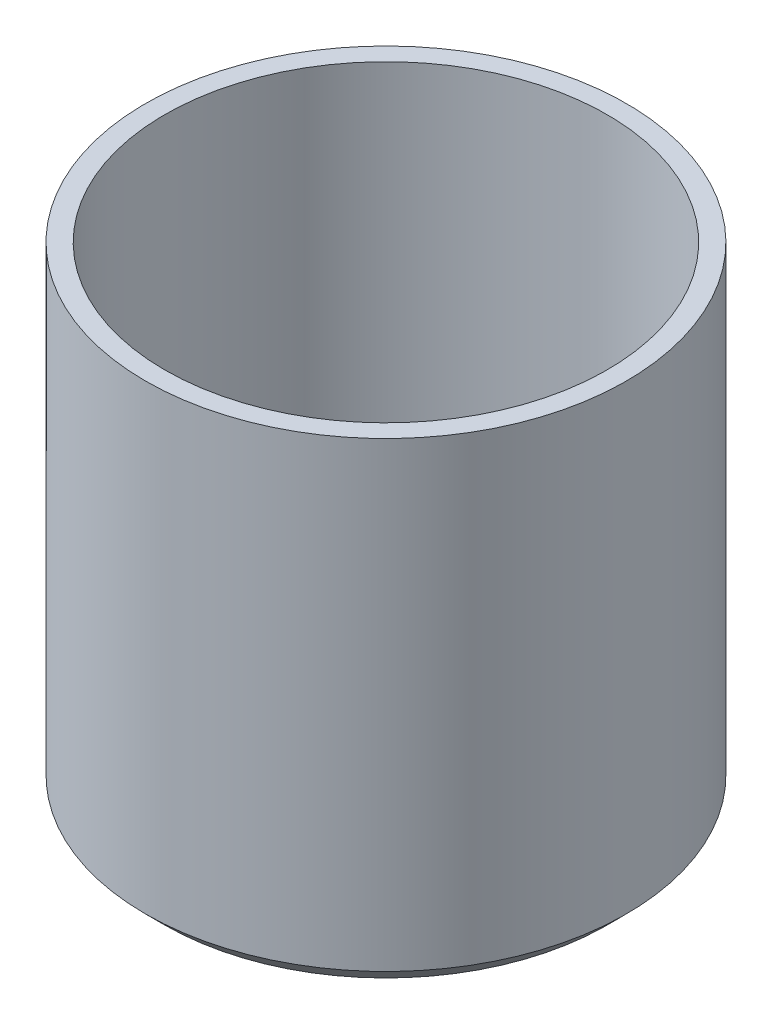
ISO-10303-21;
HEADER;
FILE_DESCRIPTION(('STEP AP214'),'2;1');
FILE_NAME('part.step','',(''),(''),'','','');
FILE_SCHEMA(('AUTOMOTIVE_DESIGN { 1 0 10303 214 1 1 1 1 }'));
ENDSEC;
DATA;
#1=APPLICATION_CONTEXT('core data for automotive mechanical design processes');
#2=APPLICATION_PROTOCOL_DEFINITION('international standard','automotive_design',2000,#1);
#3=PRODUCT_CONTEXT('',#1,'mechanical');
#4=PRODUCT('Part','Part','',(#3));
#5=PRODUCT_RELATED_PRODUCT_CATEGORY('part','',(#4));
#6=PRODUCT_DEFINITION_FORMATION('','',#4);
#7=PRODUCT_DEFINITION_CONTEXT('part definition',#1,'design');
#8=PRODUCT_DEFINITION('design','',#6,#7);
#9=PRODUCT_DEFINITION_SHAPE('','',#8);
#10=(LENGTH_UNIT() NAMED_UNIT(*) SI_UNIT(.MILLI.,.METRE.));
#11=(NAMED_UNIT(*) PLANE_ANGLE_UNIT() SI_UNIT($,.RADIAN.));
#12=(NAMED_UNIT(*) SI_UNIT($,.STERADIAN.) SOLID_ANGLE_UNIT());
#13=UNCERTAINTY_MEASURE_WITH_UNIT(LENGTH_MEASURE(1.E-05),#10,'distance_accuracy_value','');
#14=(GEOMETRIC_REPRESENTATION_CONTEXT(3) GLOBAL_UNCERTAINTY_ASSIGNED_CONTEXT((#13)) GLOBAL_UNIT_ASSIGNED_CONTEXT((#10,
#11,#12)) REPRESENTATION_CONTEXT('',''));
#15=CARTESIAN_POINT('',(0.,0.,0.));
#16=DIRECTION('',(0.,0.,1.));
#17=DIRECTION('',(1.,0.,0.));
#18=AXIS2_PLACEMENT_3D('',#15,#16,#17);
#19=CARTESIAN_POINT('',(0.,25.,0.));
#20=DIRECTION('',(0.,-1.,0.));
#21=DIRECTION('',(0.,0.,-1.));
#22=AXIS2_PLACEMENT_3D('',#19,#20,#21);
#23=CYLINDRICAL_SURFACE('',#22,12.5);
#24=CARTESIAN_POINT('',(0.,0.999999999999994,0.));
#25=DIRECTION('',(0.,1.,0.));
#26=DIRECTION('',(0.,0.,1.));
#27=AXIS2_PLACEMENT_3D('',#24,#25,#26);
#28=CIRCLE('',#27,12.5);
#29=CARTESIAN_POINT('',(0.,0.999999999999994,12.5));
#30=VERTEX_POINT('',#29);
#31=EDGE_CURVE('E48',#30,#30,#28,.T.);
#32=ORIENTED_EDGE('',*,*,#31,.T.);
#33=EDGE_LOOP('',(#32));
#34=FACE_BOUND('',#33,.T.);
#35=CARTESIAN_POINT('',(0.,25.,0.));
#36=DIRECTION('',(0.,1.,0.));
#37=DIRECTION('',(0.,0.,1.));
#38=AXIS2_PLACEMENT_3D('',#35,#36,#37);
#39=CIRCLE('',#38,12.5);
#40=CARTESIAN_POINT('',(0.,25.,12.5));
#41=VERTEX_POINT('',#40);
#42=EDGE_CURVE('E53',#41,#41,#39,.T.);
#43=ORIENTED_EDGE('',*,*,#42,.F.);
#44=EDGE_LOOP('',(#43));
#45=FACE_BOUND('',#44,.T.);
#46=ADVANCED_FACE('F33',(#34,#45),#23,.T.);
#47=CARTESIAN_POINT('',(0.,25.,0.));
#48=DIRECTION('',(0.,1.,0.));
#49=DIRECTION('',(0.,0.,1.));
#50=AXIS2_PLACEMENT_3D('',#47,#48,#49);
#51=PLANE('',#50);
#52=CARTESIAN_POINT('',(0.,25.,0.));
#53=DIRECTION('',(0.,1.,0.));
#54=DIRECTION('',(0.,0.,1.));
#55=AXIS2_PLACEMENT_3D('',#52,#53,#54);
#56=CIRCLE('',#55,11.5);
#57=CARTESIAN_POINT('',(0.,25.,11.5));
#58=VERTEX_POINT('',#57);
#59=EDGE_CURVE('E56',#58,#58,#56,.T.);
#60=ORIENTED_EDGE('',*,*,#59,.F.);
#61=EDGE_LOOP('',(#60));
#62=FACE_BOUND('',#61,.T.);
#63=ORIENTED_EDGE('',*,*,#42,.T.);
#64=EDGE_LOOP('',(#63));
#65=FACE_BOUND('',#64,.T.);
#66=ADVANCED_FACE('F168',(#62,#65),#51,.T.);
#67=CARTESIAN_POINT('',(0.,0.,0.));
#68=DIRECTION('',(0.,1.,0.));
#69=DIRECTION('',(0.,0.,1.));
#70=AXIS2_PLACEMENT_3D('',#67,#68,#69);
#71=PLANE('',#70);
#72=CARTESIAN_POINT('',(0.,0.,0.));
#73=DIRECTION('',(0.,1.,0.));
#74=DIRECTION('',(0.,0.,1.));
#75=AXIS2_PLACEMENT_3D('',#72,#73,#74);
#76=CIRCLE('',#75,11.5);
#77=CARTESIAN_POINT('',(0.,0.,11.5));
#78=VERTEX_POINT('',#77);
#79=EDGE_CURVE('E44',#78,#78,#76,.F.);
#80=ORIENTED_EDGE('',*,*,#79,.T.);
#81=EDGE_LOOP('',(#80));
#82=FACE_BOUND('',#81,.T.);
#83=CARTESIAN_POINT('',(-2.82842712474616,0.,2.82842712474621));
#84=DIRECTION('',(0.,-1.,0.));
#85=DIRECTION('',(0.,0.,-1.));
#86=AXIS2_PLACEMENT_3D('',#83,#84,#85);
#87=CIRCLE('',#86,1.);
#88=CARTESIAN_POINT('',(-2.82842712474616,0.,1.82842712474621));
#89=VERTEX_POINT('',#88);
#90=EDGE_CURVE('E63',#89,#89,#87,.T.);
#91=ORIENTED_EDGE('',*,*,#90,.F.);
#92=EDGE_LOOP('',(#91));
#93=FACE_BOUND('',#92,.T.);
#94=CARTESIAN_POINT('',(-5.65685424949233,0.,5.65685424949243));
#95=DIRECTION('',(0.,-1.,0.));
#96=DIRECTION('',(0.,0.,-1.));
#97=AXIS2_PLACEMENT_3D('',#94,#95,#96);
#98=CIRCLE('',#97,1.);
#99=CARTESIAN_POINT('',(-5.65685424949233,0.,4.65685424949243));
#100=VERTEX_POINT('',#99);
#101=EDGE_CURVE('E106',#100,#100,#98,.T.);
#102=ORIENTED_EDGE('',*,*,#101,.F.);
#103=EDGE_LOOP('',(#102));
#104=FACE_BOUND('',#103,.T.);
#105=CARTESIAN_POINT('',(0.,0.,8.));
#106=DIRECTION('',(0.,-1.,0.));
#107=DIRECTION('',(0.,0.,-1.));
#108=AXIS2_PLACEMENT_3D('',#105,#106,#107);
#109=CIRCLE('',#108,0.999999999999999);
#110=CARTESIAN_POINT('',(0.,0.,7.));
#111=VERTEX_POINT('',#110);
#112=EDGE_CURVE('E100',#111,#111,#109,.T.);
#113=ORIENTED_EDGE('',*,*,#112,.F.);
#114=EDGE_LOOP('',(#113));
#115=FACE_BOUND('',#114,.T.);
#116=CARTESIAN_POINT('',(0.,0.,4.));
#117=DIRECTION('',(0.,-1.,0.));
#118=DIRECTION('',(0.,0.,-1.));
#119=AXIS2_PLACEMENT_3D('',#116,#117,#118);
#120=CIRCLE('',#119,1.);
#121=CARTESIAN_POINT('',(0.,0.,3.));
#122=VERTEX_POINT('',#121);
#123=EDGE_CURVE('E94',#122,#122,#120,.T.);
#124=ORIENTED_EDGE('',*,*,#123,.F.);
#125=EDGE_LOOP('',(#124));
#126=FACE_BOUND('',#125,.T.);
#127=CARTESIAN_POINT('',(2.82842712474623,0.,2.82842712474616));
#128=DIRECTION('',(0.,-1.,0.));
#129=DIRECTION('',(0.,0.,-1.));
#130=AXIS2_PLACEMENT_3D('',#127,#128,#129);
#131=CIRCLE('',#130,1.);
#132=CARTESIAN_POINT('',(2.82842712474623,0.,1.82842712474616));
#133=VERTEX_POINT('',#132);
#134=EDGE_CURVE('E88',#133,#133,#131,.T.);
#135=ORIENTED_EDGE('',*,*,#134,.F.);
#136=EDGE_LOOP('',(#135));
#137=FACE_BOUND('',#136,.T.);
#138=CARTESIAN_POINT('',(5.65685424949245,0.,5.65685424949231));
#139=DIRECTION('',(0.,-1.,0.));
#140=DIRECTION('',(0.,0.,-1.));
#141=AXIS2_PLACEMENT_3D('',#138,#139,#140);
#142=CIRCLE('',#141,0.999999999999999);
#143=CARTESIAN_POINT('',(5.65685424949245,0.,4.65685424949231));
#144=VERTEX_POINT('',#143);
#145=EDGE_CURVE('E82',#144,#144,#142,.T.);
#146=ORIENTED_EDGE('',*,*,#145,.F.);
#147=EDGE_LOOP('',(#146));
#148=FACE_BOUND('',#147,.T.);
#149=CARTESIAN_POINT('',(8.,0.,0.));
#150=DIRECTION('',(0.,-1.,0.));
#151=DIRECTION('',(0.,0.,-1.));
#152=AXIS2_PLACEMENT_3D('',#149,#150,#151);
#153=CIRCLE('',#152,1.);
#154=CARTESIAN_POINT('',(8.,0.,-1.));
#155=VERTEX_POINT('',#154);
#156=EDGE_CURVE('E76',#155,#155,#153,.T.);
#157=ORIENTED_EDGE('',*,*,#156,.F.);
#158=EDGE_LOOP('',(#157));
#159=FACE_BOUND('',#158,.T.);
#160=CARTESIAN_POINT('',(4.,0.,0.));
#161=DIRECTION('',(0.,-1.,0.));
#162=DIRECTION('',(0.,0.,-1.));
#163=AXIS2_PLACEMENT_3D('',#160,#161,#162);
#164=CIRCLE('',#163,1.);
#165=CARTESIAN_POINT('',(4.,0.,-1.));
#166=VERTEX_POINT('',#165);
#167=EDGE_CURVE('E69',#166,#166,#164,.T.);
#168=ORIENTED_EDGE('',*,*,#167,.F.);
#169=EDGE_LOOP('',(#168));
#170=FACE_BOUND('',#169,.T.);
#171=CARTESIAN_POINT('',(0.,0.,-8.));
#172=DIRECTION('',(0.,-1.,0.));
#173=DIRECTION('',(0.,0.,-1.));
#174=AXIS2_PLACEMENT_3D('',#171,#172,#173);
#175=CIRCLE('',#174,1.);
#176=CARTESIAN_POINT('',(0.,0.,-9.));
#177=VERTEX_POINT('',#176);
#178=EDGE_CURVE('E141',#177,#177,#175,.T.);
#179=ORIENTED_EDGE('',*,*,#178,.F.);
#180=EDGE_LOOP('',(#179));
#181=FACE_BOUND('',#180,.T.);
#182=CARTESIAN_POINT('',(-5.65685424949241,0.,-5.65685424949235));
#183=DIRECTION('',(0.,-1.,0.));
#184=DIRECTION('',(0.,0.,-1.));
#185=AXIS2_PLACEMENT_3D('',#182,#183,#184);
#186=CIRCLE('',#185,1.);
#187=CARTESIAN_POINT('',(-5.65685424949241,0.,-6.65685424949235));
#188=VERTEX_POINT('',#187);
#189=EDGE_CURVE('E147',#188,#188,#186,.T.);
#190=ORIENTED_EDGE('',*,*,#189,.F.);
#191=EDGE_LOOP('',(#190));
#192=FACE_BOUND('',#191,.T.);
#193=CARTESIAN_POINT('',(-8.,0.,0.));
#194=DIRECTION('',(0.,-1.,0.));
#195=DIRECTION('',(0.,0.,-1.));
#196=AXIS2_PLACEMENT_3D('',#193,#194,#195);
#197=CIRCLE('',#196,0.999999999999999);
#198=CARTESIAN_POINT('',(-8.,0.,-0.999999999999943));
#199=VERTEX_POINT('',#198);
#200=EDGE_CURVE('E153',#199,#199,#197,.T.);
#201=ORIENTED_EDGE('',*,*,#200,.F.);
#202=EDGE_LOOP('',(#201));
#203=FACE_BOUND('',#202,.T.);
#204=CARTESIAN_POINT('',(-4.,0.,0.));
#205=DIRECTION('',(0.,-1.,0.));
#206=DIRECTION('',(0.,0.,-1.));
#207=AXIS2_PLACEMENT_3D('',#204,#205,#206);
#208=CIRCLE('',#207,0.999999999999999);
#209=CARTESIAN_POINT('',(-4.,0.,-0.999999999999971));
#210=VERTEX_POINT('',#209);
#211=EDGE_CURVE('E118',#210,#210,#208,.T.);
#212=ORIENTED_EDGE('',*,*,#211,.F.);
#213=EDGE_LOOP('',(#212));
#214=FACE_BOUND('',#213,.T.);
#215=CARTESIAN_POINT('',(-2.82842712474621,0.,-2.82842712474618));
#216=DIRECTION('',(0.,-1.,0.));
#217=DIRECTION('',(0.,0.,-1.));
#218=AXIS2_PLACEMENT_3D('',#215,#216,#217);
#219=CIRCLE('',#218,1.);
#220=CARTESIAN_POINT('',(-2.82842712474621,0.,-3.82842712474617));
#221=VERTEX_POINT('',#220);
#222=EDGE_CURVE('E117',#221,#221,#219,.T.);
#223=ORIENTED_EDGE('',*,*,#222,.F.);
#224=EDGE_LOOP('',(#223));
#225=FACE_BOUND('',#224,.T.);
#226=CARTESIAN_POINT('',(0.,0.,-4.));
#227=DIRECTION('',(0.,-1.,0.));
#228=DIRECTION('',(0.,0.,-1.));
#229=AXIS2_PLACEMENT_3D('',#226,#227,#228);
#230=CIRCLE('',#229,1.);
#231=CARTESIAN_POINT('',(0.,0.,-5.));
#232=VERTEX_POINT('',#231);
#233=EDGE_CURVE('E124',#232,#232,#230,.T.);
#234=ORIENTED_EDGE('',*,*,#233,.F.);
#235=EDGE_LOOP('',(#234));
#236=FACE_BOUND('',#235,.T.);
#237=CARTESIAN_POINT('',(5.65685424949237,0.,-5.65685424949239));
#238=DIRECTION('',(0.,-1.,0.));
#239=DIRECTION('',(0.,0.,-1.));
#240=AXIS2_PLACEMENT_3D('',#237,#238,#239);
#241=CIRCLE('',#240,0.999999999999999);
#242=CARTESIAN_POINT('',(5.65685424949237,0.,-6.65685424949239));
#243=VERTEX_POINT('',#242);
#244=EDGE_CURVE('E130',#243,#243,#241,.T.);
#245=ORIENTED_EDGE('',*,*,#244,.F.);
#246=EDGE_LOOP('',(#245));
#247=FACE_BOUND('',#246,.T.);
#248=CARTESIAN_POINT('',(2.82842712474619,0.,-2.8284271247462));
#249=DIRECTION('',(0.,-1.,0.));
#250=DIRECTION('',(0.,0.,-1.));
#251=AXIS2_PLACEMENT_3D('',#248,#249,#250);
#252=CIRCLE('',#251,1.);
#253=CARTESIAN_POINT('',(2.82842712474619,0.,-3.8284271247462));
#254=VERTEX_POINT('',#253);
#255=EDGE_CURVE('E70',#254,#254,#252,.T.);
#256=ORIENTED_EDGE('',*,*,#255,.F.);
#257=EDGE_LOOP('',(#256));
#258=FACE_BOUND('',#257,.T.);
#259=CARTESIAN_POINT('',(0.,0.,0.));
#260=DIRECTION('',(0.,-1.,0.));
#261=DIRECTION('',(0.,0.,-1.));
#262=AXIS2_PLACEMENT_3D('',#259,#260,#261);
#263=CIRCLE('',#262,1.);
#264=CARTESIAN_POINT('',(0.,0.,-1.));
#265=VERTEX_POINT('',#264);
#266=EDGE_CURVE('E59',#265,#265,#263,.T.);
#267=ORIENTED_EDGE('',*,*,#266,.F.);
#268=EDGE_LOOP('',(#267));
#269=FACE_BOUND('',#268,.T.);
#270=ADVANCED_FACE('F164',(#82,#93,#104,#115,#126,#137,#148,#159,#170,#181,#192,#203,#214,#225,
#236,#247,#258,#269),#71,.F.);
#271=CARTESIAN_POINT('',(0.,-32.5269119345812,0.));
#272=DIRECTION('',(0.,1.,0.));
#273=DIRECTION('',(0.,0.,1.));
#274=AXIS2_PLACEMENT_3D('',#271,#272,#273);
#275=CYLINDRICAL_SURFACE('',#274,11.5);
#276=CARTESIAN_POINT('',(0.,2.,0.));
#277=DIRECTION('',(0.,1.,0.));
#278=DIRECTION('',(0.,0.,1.));
#279=AXIS2_PLACEMENT_3D('',#276,#277,#278);
#280=CIRCLE('',#279,11.5);
#281=CARTESIAN_POINT('',(0.,2.,11.5));
#282=VERTEX_POINT('',#281);
#283=EDGE_CURVE('E40',#282,#282,#280,.F.);
#284=ORIENTED_EDGE('',*,*,#283,.T.);
#285=EDGE_LOOP('',(#284));
#286=FACE_BOUND('',#285,.T.);
#287=ORIENTED_EDGE('',*,*,#59,.T.);
#288=EDGE_LOOP('',(#287));
#289=FACE_BOUND('',#288,.T.);
#290=ADVANCED_FACE('F167',(#286,#289),#275,.F.);
#291=CARTESIAN_POINT('',(0.,1.,0.));
#292=DIRECTION('',(0.,1.,0.));
#293=DIRECTION('',(0.,0.,1.));
#294=AXIS2_PLACEMENT_3D('',#291,#292,#293);
#295=PLANE('',#294);
#296=CARTESIAN_POINT('',(0.,1.,0.));
#297=DIRECTION('',(0.,1.,0.));
#298=DIRECTION('',(0.,0.,1.));
#299=AXIS2_PLACEMENT_3D('',#296,#297,#298);
#300=CIRCLE('',#299,10.5);
#301=CARTESIAN_POINT('',(0.,1.,10.5));
#302=VERTEX_POINT('',#301);
#303=EDGE_CURVE('E11',#302,#302,#300,.T.);
#304=ORIENTED_EDGE('',*,*,#303,.T.);
#305=EDGE_LOOP('',(#304));
#306=FACE_BOUND('',#305,.T.);
#307=CARTESIAN_POINT('',(-2.82842712474616,1.,2.82842712474621));
#308=DIRECTION('',(0.,1.,0.));
#309=DIRECTION('',(0.,0.,1.));
#310=AXIS2_PLACEMENT_3D('',#307,#308,#309);
#311=CIRCLE('',#310,1.);
#312=CARTESIAN_POINT('',(-2.82842712474616,1.,3.82842712474621));
#313=VERTEX_POINT('',#312);
#314=EDGE_CURVE('E109',#313,#313,#311,.F.);
#315=ORIENTED_EDGE('',*,*,#314,.T.);
#316=EDGE_LOOP('',(#315));
#317=FACE_BOUND('',#316,.T.);
#318=CARTESIAN_POINT('',(-5.65685424949233,1.,5.65685424949243));
#319=DIRECTION('',(0.,1.,0.));
#320=DIRECTION('',(0.,0.,1.));
#321=AXIS2_PLACEMENT_3D('',#318,#319,#320);
#322=CIRCLE('',#321,1.);
#323=CARTESIAN_POINT('',(-5.65685424949233,1.,6.65685424949243));
#324=VERTEX_POINT('',#323);
#325=EDGE_CURVE('E103',#324,#324,#322,.F.);
#326=ORIENTED_EDGE('',*,*,#325,.T.);
#327=EDGE_LOOP('',(#326));
#328=FACE_BOUND('',#327,.T.);
#329=CARTESIAN_POINT('',(0.,1.,8.));
#330=DIRECTION('',(0.,1.,0.));
#331=DIRECTION('',(0.,0.,1.));
#332=AXIS2_PLACEMENT_3D('',#329,#330,#331);
#333=CIRCLE('',#332,0.999999999999999);
#334=CARTESIAN_POINT('',(0.,1.,9.));
#335=VERTEX_POINT('',#334);
#336=EDGE_CURVE('E97',#335,#335,#333,.F.);
#337=ORIENTED_EDGE('',*,*,#336,.T.);
#338=EDGE_LOOP('',(#337));
#339=FACE_BOUND('',#338,.T.);
#340=CARTESIAN_POINT('',(0.,1.,4.));
#341=DIRECTION('',(0.,1.,0.));
#342=DIRECTION('',(0.,0.,1.));
#343=AXIS2_PLACEMENT_3D('',#340,#341,#342);
#344=CIRCLE('',#343,1.);
#345=CARTESIAN_POINT('',(0.,1.,5.));
#346=VERTEX_POINT('',#345);
#347=EDGE_CURVE('E91',#346,#346,#344,.F.);
#348=ORIENTED_EDGE('',*,*,#347,.T.);
#349=EDGE_LOOP('',(#348));
#350=FACE_BOUND('',#349,.T.);
#351=CARTESIAN_POINT('',(2.82842712474623,1.,2.82842712474616));
#352=DIRECTION('',(0.,1.,0.));
#353=DIRECTION('',(0.,0.,1.));
#354=AXIS2_PLACEMENT_3D('',#351,#352,#353);
#355=CIRCLE('',#354,1.);
#356=CARTESIAN_POINT('',(2.82842712474623,1.,3.82842712474616));
#357=VERTEX_POINT('',#356);
#358=EDGE_CURVE('E85',#357,#357,#355,.F.);
#359=ORIENTED_EDGE('',*,*,#358,.T.);
#360=EDGE_LOOP('',(#359));
#361=FACE_BOUND('',#360,.T.);
#362=CARTESIAN_POINT('',(5.65685424949245,1.,5.65685424949231));
#363=DIRECTION('',(0.,1.,0.));
#364=DIRECTION('',(0.,0.,1.));
#365=AXIS2_PLACEMENT_3D('',#362,#363,#364);
#366=CIRCLE('',#365,0.999999999999999);
#367=CARTESIAN_POINT('',(5.65685424949245,1.,6.65685424949231));
#368=VERTEX_POINT('',#367);
#369=EDGE_CURVE('E79',#368,#368,#366,.F.);
#370=ORIENTED_EDGE('',*,*,#369,.T.);
#371=EDGE_LOOP('',(#370));
#372=FACE_BOUND('',#371,.T.);
#373=CARTESIAN_POINT('',(8.,1.,0.));
#374=DIRECTION('',(0.,1.,0.));
#375=DIRECTION('',(0.,0.,1.));
#376=AXIS2_PLACEMENT_3D('',#373,#374,#375);
#377=CIRCLE('',#376,1.);
#378=CARTESIAN_POINT('',(8.,1.,1.));
#379=VERTEX_POINT('',#378);
#380=EDGE_CURVE('E73',#379,#379,#377,.F.);
#381=ORIENTED_EDGE('',*,*,#380,.T.);
#382=EDGE_LOOP('',(#381));
#383=FACE_BOUND('',#382,.T.);
#384=CARTESIAN_POINT('',(4.,1.,0.));
#385=DIRECTION('',(0.,1.,0.));
#386=DIRECTION('',(0.,0.,1.));
#387=AXIS2_PLACEMENT_3D('',#384,#385,#386);
#388=CIRCLE('',#387,1.);
#389=CARTESIAN_POINT('',(4.,1.,1.));
#390=VERTEX_POINT('',#389);
#391=EDGE_CURVE('E66',#390,#390,#388,.F.);
#392=ORIENTED_EDGE('',*,*,#391,.T.);
#393=EDGE_LOOP('',(#392));
#394=FACE_BOUND('',#393,.T.);
#395=CARTESIAN_POINT('',(0.,1.,-8.));
#396=DIRECTION('',(0.,1.,0.));
#397=DIRECTION('',(0.,0.,1.));
#398=AXIS2_PLACEMENT_3D('',#395,#396,#397);
#399=CIRCLE('',#398,1.);
#400=CARTESIAN_POINT('',(0.,1.,-7.));
#401=VERTEX_POINT('',#400);
#402=EDGE_CURVE('E138',#401,#401,#399,.F.);
#403=ORIENTED_EDGE('',*,*,#402,.T.);
#404=EDGE_LOOP('',(#403));
#405=FACE_BOUND('',#404,.T.);
#406=CARTESIAN_POINT('',(-5.65685424949241,1.,-5.65685424949235));
#407=DIRECTION('',(0.,1.,0.));
#408=DIRECTION('',(0.,0.,1.));
#409=AXIS2_PLACEMENT_3D('',#406,#407,#408);
#410=CIRCLE('',#409,1.);
#411=CARTESIAN_POINT('',(-5.65685424949241,1.,-4.65685424949235));
#412=VERTEX_POINT('',#411);
#413=EDGE_CURVE('E144',#412,#412,#410,.F.);
#414=ORIENTED_EDGE('',*,*,#413,.T.);
#415=EDGE_LOOP('',(#414));
#416=FACE_BOUND('',#415,.T.);
#417=CARTESIAN_POINT('',(-8.,1.,0.));
#418=DIRECTION('',(0.,1.,0.));
#419=DIRECTION('',(0.,0.,1.));
#420=AXIS2_PLACEMENT_3D('',#417,#418,#419);
#421=CIRCLE('',#420,0.999999999999999);
#422=CARTESIAN_POINT('',(-8.,1.,1.00000000000006));
#423=VERTEX_POINT('',#422);
#424=EDGE_CURVE('E150',#423,#423,#421,.F.);
#425=ORIENTED_EDGE('',*,*,#424,.T.);
#426=EDGE_LOOP('',(#425));
#427=FACE_BOUND('',#426,.T.);
#428=CARTESIAN_POINT('',(-4.,1.,0.));
#429=DIRECTION('',(0.,1.,0.));
#430=DIRECTION('',(0.,0.,1.));
#431=AXIS2_PLACEMENT_3D('',#428,#429,#430);
#432=CIRCLE('',#431,0.999999999999999);
#433=CARTESIAN_POINT('',(-4.,1.,1.00000000000003));
#434=VERTEX_POINT('',#433);
#435=EDGE_CURVE('E156',#434,#434,#432,.F.);
#436=ORIENTED_EDGE('',*,*,#435,.T.);
#437=EDGE_LOOP('',(#436));
#438=FACE_BOUND('',#437,.T.);
#439=CARTESIAN_POINT('',(-2.82842712474621,1.,-2.82842712474618));
#440=DIRECTION('',(0.,1.,0.));
#441=DIRECTION('',(0.,0.,1.));
#442=AXIS2_PLACEMENT_3D('',#439,#440,#441);
#443=CIRCLE('',#442,1.);
#444=CARTESIAN_POINT('',(-2.82842712474621,1.,-1.82842712474618));
#445=VERTEX_POINT('',#444);
#446=EDGE_CURVE('E114',#445,#445,#443,.F.);
#447=ORIENTED_EDGE('',*,*,#446,.T.);
#448=EDGE_LOOP('',(#447));
#449=FACE_BOUND('',#448,.T.);
#450=CARTESIAN_POINT('',(0.,1.,-4.));
#451=DIRECTION('',(0.,1.,0.));
#452=DIRECTION('',(0.,0.,1.));
#453=AXIS2_PLACEMENT_3D('',#450,#451,#452);
#454=CIRCLE('',#453,1.);
#455=CARTESIAN_POINT('',(0.,1.,-3.));
#456=VERTEX_POINT('',#455);
#457=EDGE_CURVE('E121',#456,#456,#454,.F.);
#458=ORIENTED_EDGE('',*,*,#457,.T.);
#459=EDGE_LOOP('',(#458));
#460=FACE_BOUND('',#459,.T.);
#461=CARTESIAN_POINT('',(5.65685424949237,1.,-5.65685424949239));
#462=DIRECTION('',(0.,1.,0.));
#463=DIRECTION('',(0.,0.,1.));
#464=AXIS2_PLACEMENT_3D('',#461,#462,#463);
#465=CIRCLE('',#464,0.999999999999999);
#466=CARTESIAN_POINT('',(5.65685424949237,1.,-4.65685424949239));
#467=VERTEX_POINT('',#466);
#468=EDGE_CURVE('E127',#467,#467,#465,.F.);
#469=ORIENTED_EDGE('',*,*,#468,.T.);
#470=EDGE_LOOP('',(#469));
#471=FACE_BOUND('',#470,.T.);
#472=CARTESIAN_POINT('',(2.82842712474619,1.,-2.8284271247462));
#473=DIRECTION('',(0.,1.,0.));
#474=DIRECTION('',(0.,0.,1.));
#475=AXIS2_PLACEMENT_3D('',#472,#473,#474);
#476=CIRCLE('',#475,1.);
#477=CARTESIAN_POINT('',(2.82842712474619,1.,-1.8284271247462));
#478=VERTEX_POINT('',#477);
#479=EDGE_CURVE('E133',#478,#478,#476,.F.);
#480=ORIENTED_EDGE('',*,*,#479,.T.);
#481=EDGE_LOOP('',(#480));
#482=FACE_BOUND('',#481,.T.);
#483=CARTESIAN_POINT('',(0.,1.,0.));
#484=DIRECTION('',(0.,1.,0.));
#485=DIRECTION('',(0.,0.,1.));
#486=AXIS2_PLACEMENT_3D('',#483,#484,#485);
#487=CIRCLE('',#486,1.);
#488=CARTESIAN_POINT('',(0.,1.,1.));
#489=VERTEX_POINT('',#488);
#490=EDGE_CURVE('E60',#489,#489,#487,.F.);
#491=ORIENTED_EDGE('',*,*,#490,.T.);
#492=EDGE_LOOP('',(#491));
#493=FACE_BOUND('',#492,.T.);
#494=ADVANCED_FACE('F184',(#306,#317,#328,#339,#350,#361,#372,#383,#394,#405,#416,#427,#438,
#449,#460,#471,#482,#493),#295,.T.);
#495=CARTESIAN_POINT('',(0.,25.001,0.));
#496=DIRECTION('',(0.,-1.,0.));
#497=DIRECTION('',(0.,0.,-1.));
#498=AXIS2_PLACEMENT_3D('',#495,#496,#497);
#499=CYLINDRICAL_SURFACE('',#498,1.);
#500=ORIENTED_EDGE('',*,*,#490,.F.);
#501=EDGE_LOOP('',(#500));
#502=FACE_BOUND('',#501,.T.);
#503=ORIENTED_EDGE('',*,*,#266,.T.);
#504=EDGE_LOOP('',(#503));
#505=FACE_BOUND('',#504,.T.);
#506=ADVANCED_FACE('F181',(#502,#505),#499,.F.);
#507=CARTESIAN_POINT('',(2.82842712474619,25.001,-2.8284271247462));
#508=DIRECTION('',(0.,-1.,0.));
#509=DIRECTION('',(0.,0.,-1.));
#510=AXIS2_PLACEMENT_3D('',#507,#508,#509);
#511=CYLINDRICAL_SURFACE('',#510,1.);
#512=ORIENTED_EDGE('',*,*,#479,.F.);
#513=EDGE_LOOP('',(#512));
#514=FACE_BOUND('',#513,.T.);
#515=ORIENTED_EDGE('',*,*,#255,.T.);
#516=EDGE_LOOP('',(#515));
#517=FACE_BOUND('',#516,.T.);
#518=ADVANCED_FACE('F183',(#514,#517),#511,.F.);
#519=CARTESIAN_POINT('',(5.65685424949237,25.001,-5.65685424949239));
#520=DIRECTION('',(0.,-1.,0.));
#521=DIRECTION('',(0.,0.,-1.));
#522=AXIS2_PLACEMENT_3D('',#519,#520,#521);
#523=CYLINDRICAL_SURFACE('',#522,0.999999999999999);
#524=ORIENTED_EDGE('',*,*,#468,.F.);
#525=EDGE_LOOP('',(#524));
#526=FACE_BOUND('',#525,.T.);
#527=ORIENTED_EDGE('',*,*,#244,.T.);
#528=EDGE_LOOP('',(#527));
#529=FACE_BOUND('',#528,.T.);
#530=ADVANCED_FACE('F191',(#526,#529),#523,.F.);
#531=CARTESIAN_POINT('',(0.,25.001,-4.));
#532=DIRECTION('',(0.,-1.,0.));
#533=DIRECTION('',(0.,0.,-1.));
#534=AXIS2_PLACEMENT_3D('',#531,#532,#533);
#535=CYLINDRICAL_SURFACE('',#534,1.);
#536=ORIENTED_EDGE('',*,*,#457,.F.);
#537=EDGE_LOOP('',(#536));
#538=FACE_BOUND('',#537,.T.);
#539=ORIENTED_EDGE('',*,*,#233,.T.);
#540=EDGE_LOOP('',(#539));
#541=FACE_BOUND('',#540,.T.);
#542=ADVANCED_FACE('F267',(#538,#541),#535,.F.);
#543=CARTESIAN_POINT('',(-2.82842712474621,25.001,-2.82842712474618));
#544=DIRECTION('',(0.,-1.,0.));
#545=DIRECTION('',(0.,0.,-1.));
#546=AXIS2_PLACEMENT_3D('',#543,#544,#545);
#547=CYLINDRICAL_SURFACE('',#546,1.);
#548=ORIENTED_EDGE('',*,*,#446,.F.);
#549=EDGE_LOOP('',(#548));
#550=FACE_BOUND('',#549,.T.);
#551=ORIENTED_EDGE('',*,*,#222,.T.);
#552=EDGE_LOOP('',(#551));
#553=FACE_BOUND('',#552,.T.);
#554=ADVANCED_FACE('F256',(#550,#553),#547,.F.);
#555=CARTESIAN_POINT('',(-4.,25.001,0.));
#556=DIRECTION('',(0.,-1.,0.));
#557=DIRECTION('',(0.,0.,-1.));
#558=AXIS2_PLACEMENT_3D('',#555,#556,#557);
#559=CYLINDRICAL_SURFACE('',#558,0.999999999999999);
#560=ORIENTED_EDGE('',*,*,#435,.F.);
#561=EDGE_LOOP('',(#560));
#562=FACE_BOUND('',#561,.T.);
#563=ORIENTED_EDGE('',*,*,#211,.T.);
#564=EDGE_LOOP('',(#563));
#565=FACE_BOUND('',#564,.T.);
#566=ADVANCED_FACE('F162',(#562,#565),#559,.F.);
#567=CARTESIAN_POINT('',(-8.,25.001,0.));
#568=DIRECTION('',(0.,-1.,0.));
#569=DIRECTION('',(0.,0.,-1.));
#570=AXIS2_PLACEMENT_3D('',#567,#568,#569);
#571=CYLINDRICAL_SURFACE('',#570,0.999999999999999);
#572=ORIENTED_EDGE('',*,*,#424,.F.);
#573=EDGE_LOOP('',(#572));
#574=FACE_BOUND('',#573,.T.);
#575=ORIENTED_EDGE('',*,*,#200,.T.);
#576=EDGE_LOOP('',(#575));
#577=FACE_BOUND('',#576,.T.);
#578=ADVANCED_FACE('F244',(#574,#577),#571,.F.);
#579=CARTESIAN_POINT('',(-5.65685424949241,25.001,-5.65685424949235));
#580=DIRECTION('',(0.,-1.,0.));
#581=DIRECTION('',(0.,0.,-1.));
#582=AXIS2_PLACEMENT_3D('',#579,#580,#581);
#583=CYLINDRICAL_SURFACE('',#582,1.);
#584=ORIENTED_EDGE('',*,*,#413,.F.);
#585=EDGE_LOOP('',(#584));
#586=FACE_BOUND('',#585,.T.);
#587=ORIENTED_EDGE('',*,*,#189,.T.);
#588=EDGE_LOOP('',(#587));
#589=FACE_BOUND('',#588,.T.);
#590=ADVANCED_FACE('F246',(#586,#589),#583,.F.);
#591=CARTESIAN_POINT('',(0.,25.001,-8.));
#592=DIRECTION('',(0.,-1.,0.));
#593=DIRECTION('',(0.,0.,-1.));
#594=AXIS2_PLACEMENT_3D('',#591,#592,#593);
#595=CYLINDRICAL_SURFACE('',#594,1.);
#596=ORIENTED_EDGE('',*,*,#402,.F.);
#597=EDGE_LOOP('',(#596));
#598=FACE_BOUND('',#597,.T.);
#599=ORIENTED_EDGE('',*,*,#178,.T.);
#600=EDGE_LOOP('',(#599));
#601=FACE_BOUND('',#600,.T.);
#602=ADVANCED_FACE('F253',(#598,#601),#595,.F.);
#603=CARTESIAN_POINT('',(4.,25.001,0.));
#604=DIRECTION('',(0.,-1.,0.));
#605=DIRECTION('',(0.,0.,-1.));
#606=AXIS2_PLACEMENT_3D('',#603,#604,#605);
#607=CYLINDRICAL_SURFACE('',#606,1.);
#608=ORIENTED_EDGE('',*,*,#391,.F.);
#609=EDGE_LOOP('',(#608));
#610=FACE_BOUND('',#609,.T.);
#611=ORIENTED_EDGE('',*,*,#167,.T.);
#612=EDGE_LOOP('',(#611));
#613=FACE_BOUND('',#612,.T.);
#614=ADVANCED_FACE('F262',(#610,#613),#607,.F.);
#615=CARTESIAN_POINT('',(8.,25.001,0.));
#616=DIRECTION('',(0.,-1.,0.));
#617=DIRECTION('',(0.,0.,-1.));
#618=AXIS2_PLACEMENT_3D('',#615,#616,#617);
#619=CYLINDRICAL_SURFACE('',#618,1.);
#620=ORIENTED_EDGE('',*,*,#380,.F.);
#621=EDGE_LOOP('',(#620));
#622=FACE_BOUND('',#621,.T.);
#623=ORIENTED_EDGE('',*,*,#156,.T.);
#624=EDGE_LOOP('',(#623));
#625=FACE_BOUND('',#624,.T.);
#626=ADVANCED_FACE('F293',(#622,#625),#619,.F.);
#627=CARTESIAN_POINT('',(5.65685424949245,25.001,5.65685424949231));
#628=DIRECTION('',(0.,-1.,0.));
#629=DIRECTION('',(0.,0.,-1.));
#630=AXIS2_PLACEMENT_3D('',#627,#628,#629);
#631=CYLINDRICAL_SURFACE('',#630,0.999999999999999);
#632=ORIENTED_EDGE('',*,*,#369,.F.);
#633=EDGE_LOOP('',(#632));
#634=FACE_BOUND('',#633,.T.);
#635=ORIENTED_EDGE('',*,*,#145,.T.);
#636=EDGE_LOOP('',(#635));
#637=FACE_BOUND('',#636,.T.);
#638=ADVANCED_FACE('F289',(#634,#637),#631,.F.);
#639=CARTESIAN_POINT('',(2.82842712474623,25.001,2.82842712474616));
#640=DIRECTION('',(0.,-1.,0.));
#641=DIRECTION('',(0.,0.,-1.));
#642=AXIS2_PLACEMENT_3D('',#639,#640,#641);
#643=CYLINDRICAL_SURFACE('',#642,1.);
#644=ORIENTED_EDGE('',*,*,#358,.F.);
#645=EDGE_LOOP('',(#644));
#646=FACE_BOUND('',#645,.T.);
#647=ORIENTED_EDGE('',*,*,#134,.T.);
#648=EDGE_LOOP('',(#647));
#649=FACE_BOUND('',#648,.T.);
#650=ADVANCED_FACE('F285',(#646,#649),#643,.F.);
#651=CARTESIAN_POINT('',(0.,25.001,4.));
#652=DIRECTION('',(0.,-1.,0.));
#653=DIRECTION('',(0.,0.,-1.));
#654=AXIS2_PLACEMENT_3D('',#651,#652,#653);
#655=CYLINDRICAL_SURFACE('',#654,1.);
#656=ORIENTED_EDGE('',*,*,#347,.F.);
#657=EDGE_LOOP('',(#656));
#658=FACE_BOUND('',#657,.T.);
#659=ORIENTED_EDGE('',*,*,#123,.T.);
#660=EDGE_LOOP('',(#659));
#661=FACE_BOUND('',#660,.T.);
#662=ADVANCED_FACE('F281',(#658,#661),#655,.F.);
#663=CARTESIAN_POINT('',(0.,25.001,8.));
#664=DIRECTION('',(0.,-1.,0.));
#665=DIRECTION('',(0.,0.,-1.));
#666=AXIS2_PLACEMENT_3D('',#663,#664,#665);
#667=CYLINDRICAL_SURFACE('',#666,0.999999999999999);
#668=ORIENTED_EDGE('',*,*,#336,.F.);
#669=EDGE_LOOP('',(#668));
#670=FACE_BOUND('',#669,.T.);
#671=ORIENTED_EDGE('',*,*,#112,.T.);
#672=EDGE_LOOP('',(#671));
#673=FACE_BOUND('',#672,.T.);
#674=ADVANCED_FACE('F277',(#670,#673),#667,.F.);
#675=CARTESIAN_POINT('',(-5.65685424949233,25.001,5.65685424949243));
#676=DIRECTION('',(0.,-1.,0.));
#677=DIRECTION('',(0.,0.,-1.));
#678=AXIS2_PLACEMENT_3D('',#675,#676,#677);
#679=CYLINDRICAL_SURFACE('',#678,1.);
#680=ORIENTED_EDGE('',*,*,#325,.F.);
#681=EDGE_LOOP('',(#680));
#682=FACE_BOUND('',#681,.T.);
#683=ORIENTED_EDGE('',*,*,#101,.T.);
#684=EDGE_LOOP('',(#683));
#685=FACE_BOUND('',#684,.T.);
#686=ADVANCED_FACE('F215',(#682,#685),#679,.F.);
#687=CARTESIAN_POINT('',(-2.82842712474616,25.001,2.82842712474621));
#688=DIRECTION('',(0.,-1.,0.));
#689=DIRECTION('',(0.,0.,-1.));
#690=AXIS2_PLACEMENT_3D('',#687,#688,#689);
#691=CYLINDRICAL_SURFACE('',#690,1.);
#692=ORIENTED_EDGE('',*,*,#314,.F.);
#693=EDGE_LOOP('',(#692));
#694=FACE_BOUND('',#693,.T.);
#695=ORIENTED_EDGE('',*,*,#90,.T.);
#696=EDGE_LOOP('',(#695));
#697=FACE_BOUND('',#696,.T.);
#698=ADVANCED_FACE('F208',(#694,#697),#691,.F.);
#699=CARTESIAN_POINT('',(0.,0.999999999999994,0.));
#700=DIRECTION('',(0.,1.,0.));
#701=DIRECTION('',(0.,0.,1.));
#702=AXIS2_PLACEMENT_3D('',#699,#700,#701);
#703=CONICAL_SURFACE('',#702,12.5,0.785398163397452);
#704=ORIENTED_EDGE('',*,*,#79,.F.);
#705=EDGE_LOOP('',(#704));
#706=FACE_BOUND('',#705,.T.);
#707=ORIENTED_EDGE('',*,*,#31,.F.);
#708=EDGE_LOOP('',(#707));
#709=FACE_BOUND('',#708,.T.);
#710=ADVANCED_FACE('F206',(#706,#709),#703,.T.);
#711=CARTESIAN_POINT('',(0.,2.,0.));
#712=DIRECTION('',(0.,1.,0.));
#713=DIRECTION('',(0.,0.,1.));
#714=AXIS2_PLACEMENT_3D('',#711,#712,#713);
#715=CONICAL_SURFACE('',#714,11.5,0.785398163397446);
#716=ORIENTED_EDGE('',*,*,#303,.F.);
#717=EDGE_LOOP('',(#716));
#718=FACE_BOUND('',#717,.T.);
#719=ORIENTED_EDGE('',*,*,#283,.F.);
#720=EDGE_LOOP('',(#719));
#721=FACE_BOUND('',#720,.T.);
#722=ADVANCED_FACE('F35',(#718,#721),#715,.F.);
#723=CLOSED_SHELL('',(#46,#66,#270,#290,#494,#506,#518,#530,#542,#554,#566,#578,#590,#602,#614,
#626,#638,#650,#662,#674,#686,#698,#710,#722));
#724=MANIFOLD_SOLID_BREP('B2',#723);
#725=ADVANCED_BREP_SHAPE_REPRESENTATION('',(#18,#724),#14);
#726=SHAPE_DEFINITION_REPRESENTATION(#9,#725);
ENDSEC;
END-ISO-10303-21;
